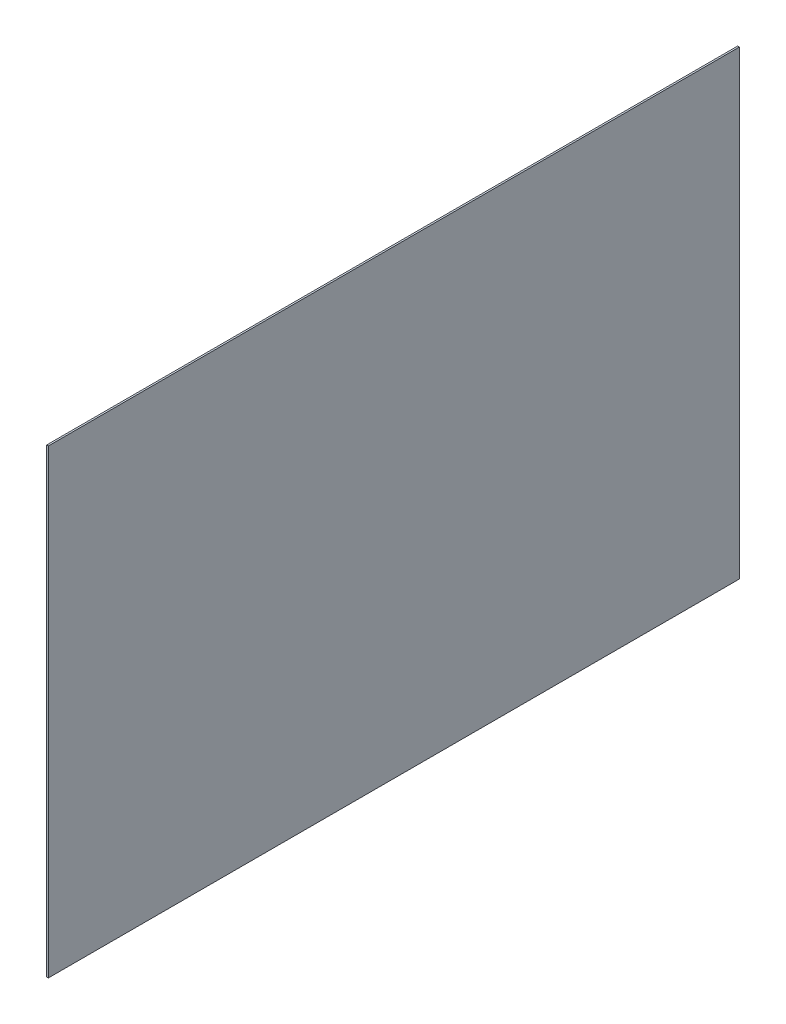
ISO-10303-21;
HEADER;
FILE_DESCRIPTION(('STEP AP214'),'2;1');
FILE_NAME('part.step','',(''),(''),'','','');
FILE_SCHEMA(('AUTOMOTIVE_DESIGN { 1 0 10303 214 1 1 1 1 }'));
ENDSEC;
DATA;
#1=APPLICATION_CONTEXT('core data for automotive mechanical design processes');
#2=APPLICATION_PROTOCOL_DEFINITION('international standard','automotive_design',2000,#1);
#3=PRODUCT_CONTEXT('',#1,'mechanical');
#4=PRODUCT('Part','Part','',(#3));
#5=PRODUCT_RELATED_PRODUCT_CATEGORY('part','',(#4));
#6=PRODUCT_DEFINITION_FORMATION('','',#4);
#7=PRODUCT_DEFINITION_CONTEXT('part definition',#1,'design');
#8=PRODUCT_DEFINITION('design','',#6,#7);
#9=PRODUCT_DEFINITION_SHAPE('','',#8);
#10=(LENGTH_UNIT() NAMED_UNIT(*) SI_UNIT(.MILLI.,.METRE.));
#11=(NAMED_UNIT(*) PLANE_ANGLE_UNIT() SI_UNIT($,.RADIAN.));
#12=(NAMED_UNIT(*) SI_UNIT($,.STERADIAN.) SOLID_ANGLE_UNIT());
#13=UNCERTAINTY_MEASURE_WITH_UNIT(LENGTH_MEASURE(1.E-05),#10,'distance_accuracy_value','');
#14=(GEOMETRIC_REPRESENTATION_CONTEXT(3) GLOBAL_UNCERTAINTY_ASSIGNED_CONTEXT((#13)) GLOBAL_UNIT_ASSIGNED_CONTEXT((#10,
#11,#12)) REPRESENTATION_CONTEXT('',''));
#15=CARTESIAN_POINT('',(0.,0.,0.));
#16=DIRECTION('',(0.,0.,1.));
#17=DIRECTION('',(1.,0.,0.));
#18=AXIS2_PLACEMENT_3D('',#15,#16,#17);
#19=CARTESIAN_POINT('',(-0.75,0.,0.));
#20=DIRECTION('',(1.,0.,0.));
#21=DIRECTION('',(0.,0.,-1.));
#22=AXIS2_PLACEMENT_3D('',#19,#20,#21);
#23=PLANE('',#22);
#24=DIRECTION('',(0.,1.,0.));
#25=VECTOR('',#24,1.);
#26=CARTESIAN_POINT('',(-0.75,-100.,-150.));
#27=LINE('',#26,#25);
#28=CARTESIAN_POINT('',(-0.75,-100.,-150.));
#29=VERTEX_POINT('',#28);
#30=CARTESIAN_POINT('',(-0.75,100.,-150.));
#31=VERTEX_POINT('',#30);
#32=EDGE_CURVE('E131',#29,#31,#27,.T.);
#33=ORIENTED_EDGE('',*,*,#32,.F.);
#34=DIRECTION('',(0.,0.,1.));
#35=VECTOR('',#34,1.);
#36=CARTESIAN_POINT('',(-0.75,-100.,-150.));
#37=LINE('',#36,#35);
#38=CARTESIAN_POINT('',(-0.75,-100.,150.));
#39=VERTEX_POINT('',#38);
#40=EDGE_CURVE('E140',#29,#39,#37,.T.);
#41=ORIENTED_EDGE('',*,*,#40,.T.);
#42=DIRECTION('',(0.,1.,0.));
#43=VECTOR('',#42,1.);
#44=CARTESIAN_POINT('',(-0.75,-100.,150.));
#45=LINE('',#44,#43);
#46=CARTESIAN_POINT('',(-0.75,100.,150.));
#47=VERTEX_POINT('',#46);
#48=EDGE_CURVE('E138',#39,#47,#45,.T.);
#49=ORIENTED_EDGE('',*,*,#48,.T.);
#50=DIRECTION('',(0.,0.,1.));
#51=VECTOR('',#50,1.);
#52=CARTESIAN_POINT('',(-0.75,100.,-150.));
#53=LINE('',#52,#51);
#54=EDGE_CURVE('E134',#31,#47,#53,.T.);
#55=ORIENTED_EDGE('',*,*,#54,.F.);
#56=EDGE_LOOP('',(#33,#41,#49,#55));
#57=FACE_BOUND('',#56,.T.);
#58=DIRECTION('',(0.,-1.,0.));
#59=VECTOR('',#58,1.);
#60=CARTESIAN_POINT('',(-0.75,-98.5,-148.5));
#61=LINE('',#60,#59);
#62=CARTESIAN_POINT('',(-0.75,98.5,-148.5));
#63=VERTEX_POINT('',#62);
#64=CARTESIAN_POINT('',(-0.75,-98.5,-148.5));
#65=VERTEX_POINT('',#64);
#66=EDGE_CURVE('E53',#63,#65,#61,.T.);
#67=ORIENTED_EDGE('',*,*,#66,.F.);
#68=DIRECTION('',(0.,0.,-1.));
#69=VECTOR('',#68,1.);
#70=CARTESIAN_POINT('',(-0.75,98.5,148.5));
#71=LINE('',#70,#69);
#72=CARTESIAN_POINT('',(-0.75,98.5,148.5));
#73=VERTEX_POINT('',#72);
#74=EDGE_CURVE('E57',#73,#63,#71,.T.);
#75=ORIENTED_EDGE('',*,*,#74,.F.);
#76=DIRECTION('',(0.,1.,0.));
#77=VECTOR('',#76,1.);
#78=CARTESIAN_POINT('',(-0.75,-98.5,148.5));
#79=LINE('',#78,#77);
#80=CARTESIAN_POINT('',(-0.75,-98.5,148.5));
#81=VERTEX_POINT('',#80);
#82=EDGE_CURVE('E274',#81,#73,#79,.T.);
#83=ORIENTED_EDGE('',*,*,#82,.F.);
#84=DIRECTION('',(0.,0.,1.));
#85=VECTOR('',#84,1.);
#86=CARTESIAN_POINT('',(-0.75,-98.5,148.5));
#87=LINE('',#86,#85);
#88=EDGE_CURVE('E280',#65,#81,#87,.T.);
#89=ORIENTED_EDGE('',*,*,#88,.F.);
#90=EDGE_LOOP('',(#67,#75,#83,#89));
#91=FACE_BOUND('',#90,.T.);
#92=ADVANCED_FACE('F36',(#57,#91),#23,.F.);
#93=CARTESIAN_POINT('',(-0.75,-100.,-150.));
#94=DIRECTION('',(0.,0.,-1.));
#95=DIRECTION('',(0.,1.,0.));
#96=AXIS2_PLACEMENT_3D('',#93,#94,#95);
#97=PLANE('',#96);
#98=DIRECTION('',(0.,1.,0.));
#99=VECTOR('',#98,1.);
#100=CARTESIAN_POINT('',(0.,-100.,-150.));
#101=LINE('',#100,#99);
#102=CARTESIAN_POINT('',(0.,-100.,-150.));
#103=VERTEX_POINT('',#102);
#104=CARTESIAN_POINT('',(0.,100.,-150.));
#105=VERTEX_POINT('',#104);
#106=EDGE_CURVE('E122',#103,#105,#101,.T.);
#107=ORIENTED_EDGE('',*,*,#106,.F.);
#108=DIRECTION('',(1.,0.,0.));
#109=VECTOR('',#108,1.);
#110=CARTESIAN_POINT('',(-0.75,-100.,-150.));
#111=LINE('',#110,#109);
#112=EDGE_CURVE('E11',#29,#103,#111,.T.);
#113=ORIENTED_EDGE('',*,*,#112,.F.);
#114=ORIENTED_EDGE('',*,*,#32,.T.);
#115=DIRECTION('',(1.,0.,0.));
#116=VECTOR('',#115,1.);
#117=CARTESIAN_POINT('',(-0.75,100.,-150.));
#118=LINE('',#117,#116);
#119=EDGE_CURVE('E40',#31,#105,#118,.T.);
#120=ORIENTED_EDGE('',*,*,#119,.T.);
#121=EDGE_LOOP('',(#107,#113,#114,#120));
#122=FACE_BOUND('',#121,.T.);
#123=ADVANCED_FACE('F38',(#122),#97,.T.);
#124=CARTESIAN_POINT('',(-0.75,-100.,-150.));
#125=DIRECTION('',(0.,1.,0.));
#126=DIRECTION('',(0.,0.,1.));
#127=AXIS2_PLACEMENT_3D('',#124,#125,#126);
#128=PLANE('',#127);
#129=DIRECTION('',(0.,0.,1.));
#130=VECTOR('',#129,1.);
#131=CARTESIAN_POINT('',(0.,-100.,-150.));
#132=LINE('',#131,#130);
#133=CARTESIAN_POINT('',(0.,-100.,150.));
#134=VERTEX_POINT('',#133);
#135=EDGE_CURVE('E135',#103,#134,#132,.T.);
#136=ORIENTED_EDGE('',*,*,#135,.T.);
#137=DIRECTION('',(1.,0.,0.));
#138=VECTOR('',#137,1.);
#139=CARTESIAN_POINT('',(-0.75,-100.,150.));
#140=LINE('',#139,#138);
#141=EDGE_CURVE('E45',#39,#134,#140,.T.);
#142=ORIENTED_EDGE('',*,*,#141,.F.);
#143=ORIENTED_EDGE('',*,*,#40,.F.);
#144=ORIENTED_EDGE('',*,*,#112,.T.);
#145=EDGE_LOOP('',(#136,#142,#143,#144));
#146=FACE_BOUND('',#145,.T.);
#147=ADVANCED_FACE('F164',(#146),#128,.F.);
#148=CARTESIAN_POINT('',(-0.75,-100.,150.));
#149=DIRECTION('',(0.,0.,-1.));
#150=DIRECTION('',(-1.,0.,0.));
#151=AXIS2_PLACEMENT_3D('',#148,#149,#150);
#152=PLANE('',#151);
#153=DIRECTION('',(0.,1.,0.));
#154=VECTOR('',#153,1.);
#155=CARTESIAN_POINT('',(0.,-100.,150.));
#156=LINE('',#155,#154);
#157=CARTESIAN_POINT('',(0.,100.,150.));
#158=VERTEX_POINT('',#157);
#159=EDGE_CURVE('E144',#134,#158,#156,.T.);
#160=ORIENTED_EDGE('',*,*,#159,.T.);
#161=DIRECTION('',(1.,0.,0.));
#162=VECTOR('',#161,1.);
#163=CARTESIAN_POINT('',(-0.75,100.,150.));
#164=LINE('',#163,#162);
#165=EDGE_CURVE('E149',#47,#158,#164,.T.);
#166=ORIENTED_EDGE('',*,*,#165,.F.);
#167=ORIENTED_EDGE('',*,*,#48,.F.);
#168=ORIENTED_EDGE('',*,*,#141,.T.);
#169=EDGE_LOOP('',(#160,#166,#167,#168));
#170=FACE_BOUND('',#169,.T.);
#171=ADVANCED_FACE('F168',(#170),#152,.F.);
#172=CARTESIAN_POINT('',(-0.75,100.,-150.));
#173=DIRECTION('',(0.,1.,0.));
#174=DIRECTION('',(0.,0.,1.));
#175=AXIS2_PLACEMENT_3D('',#172,#173,#174);
#176=PLANE('',#175);
#177=DIRECTION('',(0.,0.,1.));
#178=VECTOR('',#177,1.);
#179=CARTESIAN_POINT('',(0.,100.,-150.));
#180=LINE('',#179,#178);
#181=EDGE_CURVE('E125',#105,#158,#180,.T.);
#182=ORIENTED_EDGE('',*,*,#181,.F.);
#183=ORIENTED_EDGE('',*,*,#119,.F.);
#184=ORIENTED_EDGE('',*,*,#54,.T.);
#185=ORIENTED_EDGE('',*,*,#165,.T.);
#186=EDGE_LOOP('',(#182,#183,#184,#185));
#187=FACE_BOUND('',#186,.T.);
#188=ADVANCED_FACE('F157',(#187),#176,.T.);
#189=CARTESIAN_POINT('',(0.,0.,0.));
#190=DIRECTION('',(1.,0.,0.));
#191=DIRECTION('',(0.,0.,-1.));
#192=AXIS2_PLACEMENT_3D('',#189,#190,#191);
#193=PLANE('',#192);
#194=ORIENTED_EDGE('',*,*,#106,.T.);
#195=ORIENTED_EDGE('',*,*,#181,.T.);
#196=ORIENTED_EDGE('',*,*,#159,.F.);
#197=ORIENTED_EDGE('',*,*,#135,.F.);
#198=EDGE_LOOP('',(#194,#195,#196,#197));
#199=FACE_BOUND('',#198,.T.);
#200=ADVANCED_FACE('F161',(#199),#193,.T.);
#201=CARTESIAN_POINT('',(-1.5,-98.5,-148.5));
#202=DIRECTION('',(0.,0.,1.));
#203=DIRECTION('',(1.,0.,0.));
#204=AXIS2_PLACEMENT_3D('',#201,#202,#203);
#205=PLANE('',#204);
#206=ORIENTED_EDGE('',*,*,#66,.T.);
#207=DIRECTION('',(1.,0.,0.));
#208=VECTOR('',#207,1.);
#209=CARTESIAN_POINT('',(-1.5,-98.5,-148.5));
#210=LINE('',#209,#208);
#211=CARTESIAN_POINT('',(-1.5,-98.5,-148.5));
#212=VERTEX_POINT('',#211);
#213=EDGE_CURVE('E105',#212,#65,#210,.T.);
#214=ORIENTED_EDGE('',*,*,#213,.F.);
#215=DIRECTION('',(0.,-1.,0.));
#216=VECTOR('',#215,1.);
#217=CARTESIAN_POINT('',(-1.5,-98.5,-148.5));
#218=LINE('',#217,#216);
#219=CARTESIAN_POINT('',(-1.5,98.5,-148.5));
#220=VERTEX_POINT('',#219);
#221=EDGE_CURVE('E111',#220,#212,#218,.T.);
#222=ORIENTED_EDGE('',*,*,#221,.F.);
#223=DIRECTION('',(1.,0.,0.));
#224=VECTOR('',#223,1.);
#225=CARTESIAN_POINT('',(-1.5,98.5,-148.5));
#226=LINE('',#225,#224);
#227=EDGE_CURVE('E272',#220,#63,#226,.T.);
#228=ORIENTED_EDGE('',*,*,#227,.T.);
#229=EDGE_LOOP('',(#206,#214,#222,#228));
#230=FACE_BOUND('',#229,.T.);
#231=ADVANCED_FACE('F121',(#230),#205,.F.);
#232=CARTESIAN_POINT('',(-1.5,-98.5,148.5));
#233=DIRECTION('',(0.,1.,0.));
#234=DIRECTION('',(0.,0.,1.));
#235=AXIS2_PLACEMENT_3D('',#232,#233,#234);
#236=PLANE('',#235);
#237=ORIENTED_EDGE('',*,*,#88,.T.);
#238=DIRECTION('',(1.,0.,0.));
#239=VECTOR('',#238,1.);
#240=CARTESIAN_POINT('',(-1.5,-98.5,148.5));
#241=LINE('',#240,#239);
#242=CARTESIAN_POINT('',(-1.5,-98.5,148.5));
#243=VERTEX_POINT('',#242);
#244=EDGE_CURVE('E107',#243,#81,#241,.T.);
#245=ORIENTED_EDGE('',*,*,#244,.F.);
#246=DIRECTION('',(0.,0.,1.));
#247=VECTOR('',#246,1.);
#248=CARTESIAN_POINT('',(-1.5,-98.5,148.5));
#249=LINE('',#248,#247);
#250=EDGE_CURVE('E100',#212,#243,#249,.T.);
#251=ORIENTED_EDGE('',*,*,#250,.F.);
#252=ORIENTED_EDGE('',*,*,#213,.T.);
#253=EDGE_LOOP('',(#237,#245,#251,#252));
#254=FACE_BOUND('',#253,.T.);
#255=ADVANCED_FACE('F103',(#254),#236,.F.);
#256=CARTESIAN_POINT('',(-1.5,-98.5,148.5));
#257=DIRECTION('',(0.,0.,-1.));
#258=DIRECTION('',(-1.,0.,0.));
#259=AXIS2_PLACEMENT_3D('',#256,#257,#258);
#260=PLANE('',#259);
#261=ORIENTED_EDGE('',*,*,#82,.T.);
#262=DIRECTION('',(1.,0.,0.));
#263=VECTOR('',#262,1.);
#264=CARTESIAN_POINT('',(-1.5,98.5,148.5));
#265=LINE('',#264,#263);
#266=CARTESIAN_POINT('',(-1.5,98.5,148.5));
#267=VERTEX_POINT('',#266);
#268=EDGE_CURVE('E127',#267,#73,#265,.T.);
#269=ORIENTED_EDGE('',*,*,#268,.F.);
#270=DIRECTION('',(0.,1.,0.));
#271=VECTOR('',#270,1.);
#272=CARTESIAN_POINT('',(-1.5,-98.5,148.5));
#273=LINE('',#272,#271);
#274=EDGE_CURVE('E110',#243,#267,#273,.T.);
#275=ORIENTED_EDGE('',*,*,#274,.F.);
#276=ORIENTED_EDGE('',*,*,#244,.T.);
#277=EDGE_LOOP('',(#261,#269,#275,#276));
#278=FACE_BOUND('',#277,.T.);
#279=ADVANCED_FACE('F200',(#278),#260,.F.);
#280=CARTESIAN_POINT('',(-1.5,98.5,148.5));
#281=DIRECTION('',(0.,-1.,0.));
#282=DIRECTION('',(0.,0.,-1.));
#283=AXIS2_PLACEMENT_3D('',#280,#281,#282);
#284=PLANE('',#283);
#285=ORIENTED_EDGE('',*,*,#74,.T.);
#286=ORIENTED_EDGE('',*,*,#227,.F.);
#287=DIRECTION('',(0.,0.,-1.));
#288=VECTOR('',#287,1.);
#289=CARTESIAN_POINT('',(-1.5,98.5,148.5));
#290=LINE('',#289,#288);
#291=EDGE_CURVE('E116',#267,#220,#290,.T.);
#292=ORIENTED_EDGE('',*,*,#291,.F.);
#293=ORIENTED_EDGE('',*,*,#268,.T.);
#294=EDGE_LOOP('',(#285,#286,#292,#293));
#295=FACE_BOUND('',#294,.T.);
#296=ADVANCED_FACE('F205',(#295),#284,.F.);
#297=CARTESIAN_POINT('',(-1.5,0.,0.));
#298=DIRECTION('',(-1.,0.,0.));
#299=DIRECTION('',(0.,0.,1.));
#300=AXIS2_PLACEMENT_3D('',#297,#298,#299);
#301=PLANE('',#300);
#302=ORIENTED_EDGE('',*,*,#221,.T.);
#303=ORIENTED_EDGE('',*,*,#250,.T.);
#304=ORIENTED_EDGE('',*,*,#274,.T.);
#305=ORIENTED_EDGE('',*,*,#291,.T.);
#306=EDGE_LOOP('',(#302,#303,#304,#305));
#307=FACE_BOUND('',#306,.T.);
#308=ADVANCED_FACE('F114',(#307),#301,.T.);
#309=CLOSED_SHELL('',(#92,#123,#147,#171,#188,#200,#231,#255,#279,#296,#308));
#310=MANIFOLD_SOLID_BREP('B2',#309);
#311=ADVANCED_BREP_SHAPE_REPRESENTATION('',(#18,#310),#14);
#312=SHAPE_DEFINITION_REPRESENTATION(#9,#311);
ENDSEC;
END-ISO-10303-21;
